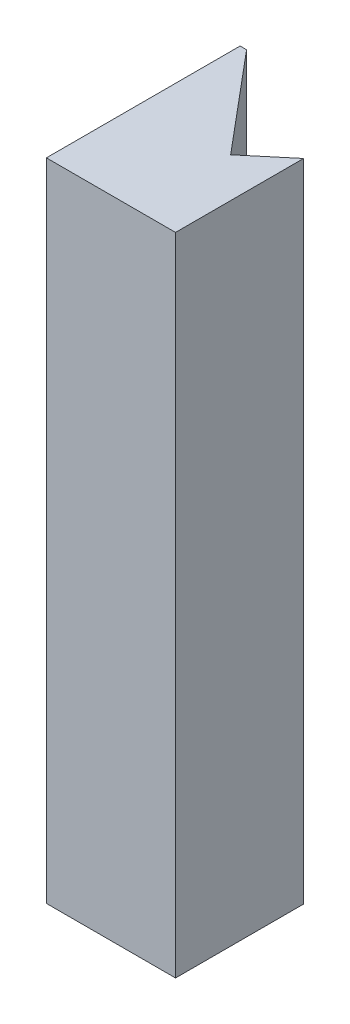
ISO-10303-21;
HEADER;
FILE_DESCRIPTION(('STEP AP214'),'2;1');
FILE_NAME('part.step','',(''),(''),'','','');
FILE_SCHEMA(('AUTOMOTIVE_DESIGN { 1 0 10303 214 1 1 1 1 }'));
ENDSEC;
DATA;
#1=APPLICATION_CONTEXT('core data for automotive mechanical design processes');
#2=APPLICATION_PROTOCOL_DEFINITION('international standard','automotive_design',2000,#1);
#3=PRODUCT_CONTEXT('',#1,'mechanical');
#4=PRODUCT('Part','Part','',(#3));
#5=PRODUCT_RELATED_PRODUCT_CATEGORY('part','',(#4));
#6=PRODUCT_DEFINITION_FORMATION('','',#4);
#7=PRODUCT_DEFINITION_CONTEXT('part definition',#1,'design');
#8=PRODUCT_DEFINITION('design','',#6,#7);
#9=PRODUCT_DEFINITION_SHAPE('','',#8);
#10=(LENGTH_UNIT() NAMED_UNIT(*) SI_UNIT(.MILLI.,.METRE.));
#11=(NAMED_UNIT(*) PLANE_ANGLE_UNIT() SI_UNIT($,.RADIAN.));
#12=(NAMED_UNIT(*) SI_UNIT($,.STERADIAN.) SOLID_ANGLE_UNIT());
#13=UNCERTAINTY_MEASURE_WITH_UNIT(LENGTH_MEASURE(1.E-05),#10,'distance_accuracy_value','');
#14=(GEOMETRIC_REPRESENTATION_CONTEXT(3) GLOBAL_UNCERTAINTY_ASSIGNED_CONTEXT((#13)) GLOBAL_UNIT_ASSIGNED_CONTEXT((#10,
#11,#12)) REPRESENTATION_CONTEXT('',''));
#15=CARTESIAN_POINT('',(0.,0.,0.));
#16=DIRECTION('',(0.,0.,1.));
#17=DIRECTION('',(1.,0.,0.));
#18=AXIS2_PLACEMENT_3D('',#15,#16,#17);
#19=CARTESIAN_POINT('',(-27.3292793020357,127.,1.88676670444323));
#20=DIRECTION('',(1.,0.,0.));
#21=DIRECTION('',(0.,0.,-1.));
#22=AXIS2_PLACEMENT_3D('',#19,#20,#21);
#23=PLANE('',#22);
#24=DIRECTION('',(0.,0.,1.));
#25=VECTOR('',#24,1.);
#26=CARTESIAN_POINT('',(-27.3292793020357,0.,1.88676670444323));
#27=LINE('',#26,#25);
#28=CARTESIAN_POINT('',(-27.3292793020357,0.,-36.2132332955568));
#29=VERTEX_POINT('',#28);
#30=CARTESIAN_POINT('',(-27.3292793020357,0.,1.88676670444323));
#31=VERTEX_POINT('',#30);
#32=EDGE_CURVE('E117',#29,#31,#27,.T.);
#33=ORIENTED_EDGE('',*,*,#32,.T.);
#34=DIRECTION('',(0.,-1.,0.));
#35=VECTOR('',#34,1.);
#36=CARTESIAN_POINT('',(-27.3292793020357,127.,1.88676670444323));
#37=LINE('',#36,#35);
#38=CARTESIAN_POINT('',(-27.3292793020357,127.,1.88676670444323));
#39=VERTEX_POINT('',#38);
#40=EDGE_CURVE('E11',#39,#31,#37,.T.);
#41=ORIENTED_EDGE('',*,*,#40,.F.);
#42=DIRECTION('',(0.,0.,1.));
#43=VECTOR('',#42,1.);
#44=CARTESIAN_POINT('',(-27.3292793020357,127.,1.88676670444323));
#45=LINE('',#44,#43);
#46=CARTESIAN_POINT('',(-27.3292793020357,127.,-36.2132332955568));
#47=VERTEX_POINT('',#46);
#48=EDGE_CURVE('E127',#47,#39,#45,.T.);
#49=ORIENTED_EDGE('',*,*,#48,.F.);
#50=DIRECTION('',(0.,-1.,0.));
#51=VECTOR('',#50,1.);
#52=CARTESIAN_POINT('',(-27.3292793020357,127.,-36.2132332955568));
#53=LINE('',#52,#51);
#54=EDGE_CURVE('E113',#47,#29,#53,.T.);
#55=ORIENTED_EDGE('',*,*,#54,.T.);
#56=EDGE_LOOP('',(#33,#41,#49,#55));
#57=FACE_BOUND('',#56,.T.);
#58=ADVANCED_FACE('F33',(#57),#23,.F.);
#59=CARTESIAN_POINT('',(-1.92927930203565,127.,1.88676670444323));
#60=DIRECTION('',(0.,0.,-1.));
#61=DIRECTION('',(-1.,0.,0.));
#62=AXIS2_PLACEMENT_3D('',#59,#60,#61);
#63=PLANE('',#62);
#64=DIRECTION('',(1.,0.,0.));
#65=VECTOR('',#64,1.);
#66=CARTESIAN_POINT('',(-1.92927930203565,0.,1.88676670444323));
#67=LINE('',#66,#65);
#68=CARTESIAN_POINT('',(-1.92927930203565,0.,1.88676670444323));
#69=VERTEX_POINT('',#68);
#70=EDGE_CURVE('E120',#31,#69,#67,.T.);
#71=ORIENTED_EDGE('',*,*,#70,.T.);
#72=DIRECTION('',(0.,-1.,0.));
#73=VECTOR('',#72,1.);
#74=CARTESIAN_POINT('',(-1.92927930203565,127.,1.88676670444323));
#75=LINE('',#74,#73);
#76=CARTESIAN_POINT('',(-1.92927930203565,127.,1.88676670444323));
#77=VERTEX_POINT('',#76);
#78=EDGE_CURVE('E41',#77,#69,#75,.T.);
#79=ORIENTED_EDGE('',*,*,#78,.F.);
#80=DIRECTION('',(1.,0.,0.));
#81=VECTOR('',#80,1.);
#82=CARTESIAN_POINT('',(-1.92927930203565,127.,1.88676670444323));
#83=LINE('',#82,#81);
#84=EDGE_CURVE('E86',#39,#77,#83,.T.);
#85=ORIENTED_EDGE('',*,*,#84,.F.);
#86=ORIENTED_EDGE('',*,*,#40,.T.);
#87=EDGE_LOOP('',(#71,#79,#85,#86));
#88=FACE_BOUND('',#87,.T.);
#89=ADVANCED_FACE('F151',(#88),#63,.F.);
#90=CARTESIAN_POINT('',(-1.92927930203565,127.,1.88676670444323));
#91=DIRECTION('',(-1.,0.,0.));
#92=DIRECTION('',(0.,0.,1.));
#93=AXIS2_PLACEMENT_3D('',#90,#91,#92);
#94=PLANE('',#93);
#95=DIRECTION('',(0.,0.,-1.));
#96=VECTOR('',#95,1.);
#97=CARTESIAN_POINT('',(-1.92927930203565,0.,1.88676670444323));
#98=LINE('',#97,#96);
#99=CARTESIAN_POINT('',(-1.92927930203565,0.,-23.3033622468247));
#100=VERTEX_POINT('',#99);
#101=EDGE_CURVE('E122',#69,#100,#98,.T.);
#102=ORIENTED_EDGE('',*,*,#101,.T.);
#103=DIRECTION('',(0.,-1.,0.));
#104=VECTOR('',#103,1.);
#105=CARTESIAN_POINT('',(-1.92927930203565,127.,-23.3033622468247));
#106=LINE('',#105,#104);
#107=CARTESIAN_POINT('',(-1.92927930203565,127.,-23.3033622468247));
#108=VERTEX_POINT('',#107);
#109=EDGE_CURVE('E108',#108,#100,#106,.T.);
#110=ORIENTED_EDGE('',*,*,#109,.F.);
#111=DIRECTION('',(0.,0.,-1.));
#112=VECTOR('',#111,1.);
#113=CARTESIAN_POINT('',(-1.92927930203565,127.,1.88676670444323));
#114=LINE('',#113,#112);
#115=EDGE_CURVE('E99',#77,#108,#114,.T.);
#116=ORIENTED_EDGE('',*,*,#115,.F.);
#117=ORIENTED_EDGE('',*,*,#78,.T.);
#118=EDGE_LOOP('',(#102,#110,#116,#117));
#119=FACE_BOUND('',#118,.T.);
#120=ADVANCED_FACE('F133',(#119),#94,.F.);
#121=CARTESIAN_POINT('',(-9.73247401599759,127.,-16.7557044403347));
#122=DIRECTION('',(0.642787609686541,0.,0.766044443118977));
#123=DIRECTION('',(0.766044443118977,0.,-0.642787609686541));
#124=AXIS2_PLACEMENT_3D('',#121,#122,#123);
#125=PLANE('',#124);
#126=DIRECTION('',(-0.766044443118977,0.,0.642787609686541));
#127=VECTOR('',#126,1.);
#128=CARTESIAN_POINT('',(-9.73247401599759,0.,-16.7557044403347));
#129=LINE('',#128,#127);
#130=CARTESIAN_POINT('',(-9.73247401599759,0.,-16.7557044403347));
#131=VERTEX_POINT('',#130);
#132=EDGE_CURVE('E107',#100,#131,#129,.T.);
#133=ORIENTED_EDGE('',*,*,#132,.T.);
#134=DIRECTION('',(0.,-1.,0.));
#135=VECTOR('',#134,1.);
#136=CARTESIAN_POINT('',(-9.73247401599759,127.,-16.7557044403347));
#137=LINE('',#136,#135);
#138=CARTESIAN_POINT('',(-9.73247401599759,127.,-16.7557044403347));
#139=VERTEX_POINT('',#138);
#140=EDGE_CURVE('E104',#139,#131,#137,.T.);
#141=ORIENTED_EDGE('',*,*,#140,.F.);
#142=DIRECTION('',(-0.766044443118977,0.,0.642787609686541));
#143=VECTOR('',#142,1.);
#144=CARTESIAN_POINT('',(-9.73247401599759,127.,-16.7557044403347));
#145=LINE('',#144,#143);
#146=EDGE_CURVE('E93',#108,#139,#145,.T.);
#147=ORIENTED_EDGE('',*,*,#146,.F.);
#148=ORIENTED_EDGE('',*,*,#109,.T.);
#149=EDGE_LOOP('',(#133,#141,#147,#148));
#150=FACE_BOUND('',#149,.T.);
#151=ADVANCED_FACE('F105',(#150),#125,.F.);
#152=CARTESIAN_POINT('',(-26.0592793020357,127.,-36.2132332955568));
#153=DIRECTION('',(-0.766044443118979,0.,0.642787609686538));
#154=DIRECTION('',(0.642787609686538,0.,0.76604444311898));
#155=AXIS2_PLACEMENT_3D('',#152,#153,#154);
#156=PLANE('',#155);
#157=DIRECTION('',(-0.642787609686538,0.,-0.766044443118979));
#158=VECTOR('',#157,1.);
#159=CARTESIAN_POINT('',(-26.0592793020357,0.,-36.2132332955568));
#160=LINE('',#159,#158);
#161=CARTESIAN_POINT('',(-26.0592793020357,0.,-36.2132332955568));
#162=VERTEX_POINT('',#161);
#163=EDGE_CURVE('E72',#131,#162,#160,.T.);
#164=ORIENTED_EDGE('',*,*,#163,.T.);
#165=DIRECTION('',(0.,-1.,0.));
#166=VECTOR('',#165,1.);
#167=CARTESIAN_POINT('',(-26.0592793020357,127.,-36.2132332955568));
#168=LINE('',#167,#166);
#169=CARTESIAN_POINT('',(-26.0592793020357,127.,-36.2132332955568));
#170=VERTEX_POINT('',#169);
#171=EDGE_CURVE('E109',#170,#162,#168,.T.);
#172=ORIENTED_EDGE('',*,*,#171,.F.);
#173=DIRECTION('',(-0.642787609686538,0.,-0.766044443118979));
#174=VECTOR('',#173,1.);
#175=CARTESIAN_POINT('',(-26.0592793020357,127.,-36.2132332955568));
#176=LINE('',#175,#174);
#177=EDGE_CURVE('E97',#139,#170,#176,.T.);
#178=ORIENTED_EDGE('',*,*,#177,.F.);
#179=ORIENTED_EDGE('',*,*,#140,.T.);
#180=EDGE_LOOP('',(#164,#172,#178,#179));
#181=FACE_BOUND('',#180,.T.);
#182=ADVANCED_FACE('F111',(#181),#156,.F.);
#183=CARTESIAN_POINT('',(-27.3292793020357,127.,-36.2132332955568));
#184=DIRECTION('',(0.,0.,1.));
#185=DIRECTION('',(1.,0.,0.));
#186=AXIS2_PLACEMENT_3D('',#183,#184,#185);
#187=PLANE('',#186);
#188=DIRECTION('',(-1.,0.,0.));
#189=VECTOR('',#188,1.);
#190=CARTESIAN_POINT('',(-27.3292793020357,0.,-36.2132332955568));
#191=LINE('',#190,#189);
#192=EDGE_CURVE('E78',#162,#29,#191,.T.);
#193=ORIENTED_EDGE('',*,*,#192,.T.);
#194=ORIENTED_EDGE('',*,*,#54,.F.);
#195=DIRECTION('',(-1.,0.,0.));
#196=VECTOR('',#195,1.);
#197=CARTESIAN_POINT('',(-27.3292793020357,127.,-36.2132332955568));
#198=LINE('',#197,#196);
#199=EDGE_CURVE('E49',#170,#47,#198,.T.);
#200=ORIENTED_EDGE('',*,*,#199,.F.);
#201=ORIENTED_EDGE('',*,*,#171,.T.);
#202=EDGE_LOOP('',(#193,#194,#200,#201));
#203=FACE_BOUND('',#202,.T.);
#204=ADVANCED_FACE('F140',(#203),#187,.F.);
#205=CARTESIAN_POINT('',(0.,127.,0.));
#206=DIRECTION('',(0.,-1.,0.));
#207=DIRECTION('',(0.,0.,-1.));
#208=AXIS2_PLACEMENT_3D('',#205,#206,#207);
#209=PLANE('',#208);
#210=ORIENTED_EDGE('',*,*,#48,.T.);
#211=ORIENTED_EDGE('',*,*,#84,.T.);
#212=ORIENTED_EDGE('',*,*,#115,.T.);
#213=ORIENTED_EDGE('',*,*,#146,.T.);
#214=ORIENTED_EDGE('',*,*,#177,.T.);
#215=ORIENTED_EDGE('',*,*,#199,.T.);
#216=EDGE_LOOP('',(#210,#211,#212,#213,#214,#215));
#217=FACE_BOUND('',#216,.T.);
#218=ADVANCED_FACE('F95',(#217),#209,.F.);
#219=CARTESIAN_POINT('',(0.,0.,0.));
#220=DIRECTION('',(0.,-1.,0.));
#221=DIRECTION('',(0.,0.,-1.));
#222=AXIS2_PLACEMENT_3D('',#219,#220,#221);
#223=PLANE('',#222);
#224=ORIENTED_EDGE('',*,*,#32,.F.);
#225=ORIENTED_EDGE('',*,*,#192,.F.);
#226=ORIENTED_EDGE('',*,*,#163,.F.);
#227=ORIENTED_EDGE('',*,*,#132,.F.);
#228=ORIENTED_EDGE('',*,*,#101,.F.);
#229=ORIENTED_EDGE('',*,*,#70,.F.);
#230=EDGE_LOOP('',(#224,#225,#226,#227,#228,#229));
#231=FACE_BOUND('',#230,.T.);
#232=ADVANCED_FACE('F136',(#231),#223,.T.);
#233=CLOSED_SHELL('',(#58,#89,#120,#151,#182,#204,#218,#232));
#234=MANIFOLD_SOLID_BREP('B2',#233);
#235=ADVANCED_BREP_SHAPE_REPRESENTATION('',(#18,#234),#14);
#236=SHAPE_DEFINITION_REPRESENTATION(#9,#235);
ENDSEC;
END-ISO-10303-21;
